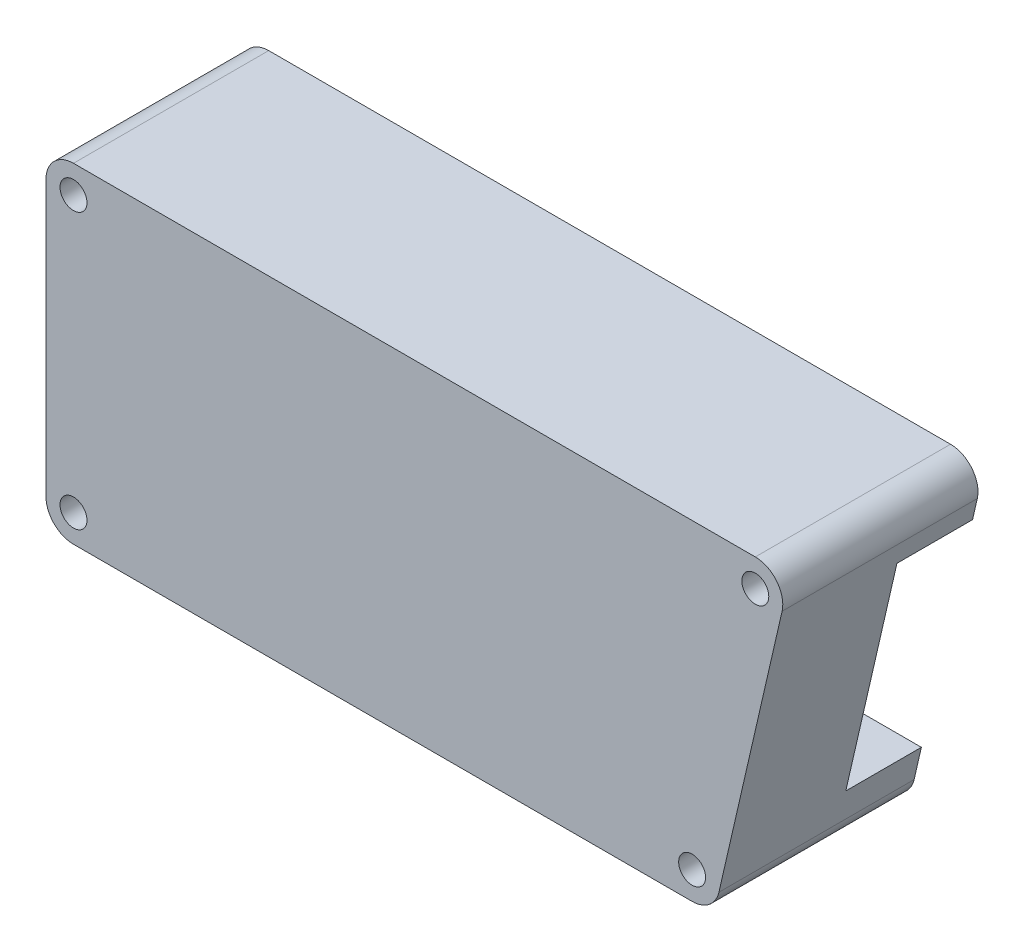
ISO-10303-21;
HEADER;
FILE_DESCRIPTION(('STEP AP214'),'2;1');
FILE_NAME('part.step','',(''),(''),'','','');
FILE_SCHEMA(('AUTOMOTIVE_DESIGN { 1 0 10303 214 1 1 1 1 }'));
ENDSEC;
DATA;
#1=APPLICATION_CONTEXT('core data for automotive mechanical design processes');
#2=APPLICATION_PROTOCOL_DEFINITION('international standard','automotive_design',2000,#1);
#3=PRODUCT_CONTEXT('',#1,'mechanical');
#4=PRODUCT('Part','Part','',(#3));
#5=PRODUCT_RELATED_PRODUCT_CATEGORY('part','',(#4));
#6=PRODUCT_DEFINITION_FORMATION('','',#4);
#7=PRODUCT_DEFINITION_CONTEXT('part definition',#1,'design');
#8=PRODUCT_DEFINITION('design','',#6,#7);
#9=PRODUCT_DEFINITION_SHAPE('','',#8);
#10=(LENGTH_UNIT() NAMED_UNIT(*) SI_UNIT(.MILLI.,.METRE.));
#11=(NAMED_UNIT(*) PLANE_ANGLE_UNIT() SI_UNIT($,.RADIAN.));
#12=(NAMED_UNIT(*) SI_UNIT($,.STERADIAN.) SOLID_ANGLE_UNIT());
#13=UNCERTAINTY_MEASURE_WITH_UNIT(LENGTH_MEASURE(1.E-05),#10,'distance_accuracy_value','');
#14=(GEOMETRIC_REPRESENTATION_CONTEXT(3) GLOBAL_UNCERTAINTY_ASSIGNED_CONTEXT((#13)) GLOBAL_UNIT_ASSIGNED_CONTEXT((#10,
#11,#12)) REPRESENTATION_CONTEXT('',''));
#15=CARTESIAN_POINT('',(0.,0.,0.));
#16=DIRECTION('',(0.,0.,1.));
#17=DIRECTION('',(1.,0.,0.));
#18=AXIS2_PLACEMENT_3D('',#15,#16,#17);
#19=CARTESIAN_POINT('',(47.0138015883952,632.037366400277,0.));
#20=DIRECTION('',(0.,0.,1.));
#21=DIRECTION('',(1.,0.,0.));
#22=AXIS2_PLACEMENT_3D('',#19,#20,#21);
#23=PLANE('',#22);
#24=CARTESIAN_POINT('',(161.313801588395,632.037366400277,0.));
#25=DIRECTION('',(0.,0.,1.));
#26=DIRECTION('',(1.,0.,0.));
#27=AXIS2_PLACEMENT_3D('',#24,#25,#26);
#28=CIRCLE('',#27,2.48919999999999);
#29=CARTESIAN_POINT('',(163.803001588395,632.037366400277,0.));
#30=VERTEX_POINT('',#29);
#31=EDGE_CURVE('E440',#30,#30,#28,.T.);
#32=ORIENTED_EDGE('',*,*,#31,.T.);
#33=EDGE_LOOP('',(#32));
#34=FACE_BOUND('',#33,.T.);
#35=CARTESIAN_POINT('',(47.0138015883952,632.037366400277,0.));
#36=DIRECTION('',(0.,0.,1.));
#37=DIRECTION('',(1.,0.,0.));
#38=AXIS2_PLACEMENT_3D('',#35,#36,#37);
#39=CIRCLE('',#38,2.48919999999998);
#40=CARTESIAN_POINT('',(49.5030015883951,632.037366400277,0.));
#41=VERTEX_POINT('',#40);
#42=EDGE_CURVE('E251',#41,#41,#39,.T.);
#43=ORIENTED_EDGE('',*,*,#42,.T.);
#44=EDGE_LOOP('',(#43));
#45=FACE_BOUND('',#44,.T.);
#46=DIRECTION('',(1.,0.,0.));
#47=VECTOR('',#46,1.);
#48=CARTESIAN_POINT('',(-8.54869841160494,636.731886589951,0.));
#49=LINE('',#48,#47);
#50=CARTESIAN_POINT('',(41.9338015883952,636.731886589951,0.));
#51=VERTEX_POINT('',#50);
#52=CARTESIAN_POINT('',(167.604993239421,636.731886589951,0.));
#53=VERTEX_POINT('',#52);
#54=EDGE_CURVE('E238',#51,#53,#49,.T.);
#55=ORIENTED_EDGE('',*,*,#54,.T.);
#56=DIRECTION('',(0.223960029134119,0.974598330262393,0.));
#57=VECTOR('',#56,1.);
#58=CARTESIAN_POINT('',(166.264761106128,630.899649452275,0.));
#59=LINE('',#58,#57);
#60=CARTESIAN_POINT('',(166.264761106128,630.899649452275,0.));
#61=VERTEX_POINT('',#60);
#62=EDGE_CURVE('E174',#61,#53,#59,.T.);
#63=ORIENTED_EDGE('',*,*,#62,.F.);
#64=CARTESIAN_POINT('',(161.313801588395,632.037366400277,0.));
#65=DIRECTION('',(0.,0.,1.));
#66=DIRECTION('',(1.,0.,0.));
#67=AXIS2_PLACEMENT_3D('',#64,#65,#66);
#68=CIRCLE('',#67,5.07999999999997);
#69=CARTESIAN_POINT('',(161.313801588395,626.957366400277,0.));
#70=VERTEX_POINT('',#69);
#71=EDGE_CURVE('E170',#70,#61,#68,.T.);
#72=ORIENTED_EDGE('',*,*,#71,.F.);
#73=DIRECTION('',(1.,0.,0.));
#74=VECTOR('',#73,1.);
#75=CARTESIAN_POINT('',(47.0138015883952,626.957366400277,0.));
#76=LINE('',#75,#74);
#77=CARTESIAN_POINT('',(47.0138015883952,626.957366400277,0.));
#78=VERTEX_POINT('',#77);
#79=EDGE_CURVE('E166',#78,#70,#76,.T.);
#80=ORIENTED_EDGE('',*,*,#79,.F.);
#81=CARTESIAN_POINT('',(47.0138015883952,632.037366400277,0.));
#82=DIRECTION('',(0.,0.,1.));
#83=DIRECTION('',(1.,0.,0.));
#84=AXIS2_PLACEMENT_3D('',#81,#82,#83);
#85=CIRCLE('',#84,5.07999999999999);
#86=CARTESIAN_POINT('',(41.9338015883952,632.037366400277,0.));
#87=VERTEX_POINT('',#86);
#88=EDGE_CURVE('E162',#87,#78,#85,.T.);
#89=ORIENTED_EDGE('',*,*,#88,.F.);
#90=DIRECTION('',(0.,-1.,0.));
#91=VECTOR('',#90,1.);
#92=CARTESIAN_POINT('',(41.9338015883952,632.037366400277,0.));
#93=LINE('',#92,#91);
#94=EDGE_CURVE('E104',#51,#87,#93,.T.);
#95=ORIENTED_EDGE('',*,*,#94,.F.);
#96=EDGE_LOOP('',(#55,#63,#72,#80,#89,#95));
#97=FACE_BOUND('',#96,.T.);
#98=ADVANCED_FACE('F47',(#34,#45,#97),#23,.F.);
#99=CARTESIAN_POINT('',(172.987502565238,682.837366400277,0.));
#100=DIRECTION('',(0.,0.,1.));
#101=DIRECTION('',(1.,0.,0.));
#102=AXIS2_PLACEMENT_3D('',#99,#100,#101);
#103=CIRCLE('',#102,2.48919999999999);
#104=CARTESIAN_POINT('',(175.476702565238,682.837366400277,0.));
#105=VERTEX_POINT('',#104);
#106=EDGE_CURVE('E453',#105,#105,#103,.T.);
#107=ORIENTED_EDGE('',*,*,#106,.T.);
#108=EDGE_LOOP('',(#107));
#109=FACE_BOUND('',#108,.T.);
#110=CARTESIAN_POINT('',(47.0138015883952,682.837366400277,0.));
#111=DIRECTION('',(0.,0.,1.));
#112=DIRECTION('',(1.,0.,0.));
#113=AXIS2_PLACEMENT_3D('',#110,#111,#112);
#114=CIRCLE('',#113,2.48919999999998);
#115=CARTESIAN_POINT('',(49.5030015883951,682.837366400277,0.));
#116=VERTEX_POINT('',#115);
#117=EDGE_CURVE('E446',#116,#116,#114,.T.);
#118=ORIENTED_EDGE('',*,*,#117,.T.);
#119=EDGE_LOOP('',(#118));
#120=FACE_BOUND('',#119,.T.);
#121=DIRECTION('',(-1.,0.,0.));
#122=VECTOR('',#121,1.);
#123=CARTESIAN_POINT('',(-8.54869841160495,677.879886589951,0.));
#124=LINE('',#123,#122);
#125=CARTESIAN_POINT('',(177.060691030663,677.879886589951,0.));
#126=VERTEX_POINT('',#125);
#127=CARTESIAN_POINT('',(41.9338015883952,677.879886589951,0.));
#128=VERTEX_POINT('',#127);
#129=EDGE_CURVE('E226',#126,#128,#124,.T.);
#130=ORIENTED_EDGE('',*,*,#129,.T.);
#131=CARTESIAN_POINT('',(41.9338015883952,682.837366400277,0.));
#132=VERTEX_POINT('',#131);
#133=EDGE_CURVE('E186',#132,#128,#93,.T.);
#134=ORIENTED_EDGE('',*,*,#133,.F.);
#135=CARTESIAN_POINT('',(47.0138015883952,682.837366400277,0.));
#136=DIRECTION('',(0.,0.,1.));
#137=DIRECTION('',(1.,0.,0.));
#138=AXIS2_PLACEMENT_3D('',#135,#136,#137);
#139=CIRCLE('',#138,5.07999999999998);
#140=CARTESIAN_POINT('',(47.0138015883952,687.917366400277,0.));
#141=VERTEX_POINT('',#140);
#142=EDGE_CURVE('E183',#141,#132,#139,.T.);
#143=ORIENTED_EDGE('',*,*,#142,.F.);
#144=DIRECTION('',(-1.,0.,0.));
#145=VECTOR('',#144,1.);
#146=CARTESIAN_POINT('',(47.0138015883952,687.917366400277,0.));
#147=LINE('',#146,#145);
#148=CARTESIAN_POINT('',(172.987502565238,687.917366400277,0.));
#149=VERTEX_POINT('',#148);
#150=EDGE_CURVE('E146',#149,#141,#147,.T.);
#151=ORIENTED_EDGE('',*,*,#150,.F.);
#152=CARTESIAN_POINT('',(172.987502565238,682.837366400277,0.));
#153=DIRECTION('',(0.,0.,1.));
#154=DIRECTION('',(1.,0.,0.));
#155=AXIS2_PLACEMENT_3D('',#152,#153,#154);
#156=CIRCLE('',#155,5.07999999999985);
#157=CARTESIAN_POINT('',(177.938462082971,681.699649452275,0.));
#158=VERTEX_POINT('',#157);
#159=EDGE_CURVE('E178',#158,#149,#156,.T.);
#160=ORIENTED_EDGE('',*,*,#159,.F.);
#161=EDGE_CURVE('E173',#126,#158,#59,.T.);
#162=ORIENTED_EDGE('',*,*,#161,.F.);
#163=EDGE_LOOP('',(#130,#134,#143,#151,#160,#162));
#164=FACE_BOUND('',#163,.T.);
#165=ADVANCED_FACE('F235',(#109,#120,#164),#23,.F.);
#166=CARTESIAN_POINT('',(166.264761106128,630.899649452275,36.068));
#167=DIRECTION('',(-0.974598330262393,0.223960029134119,0.));
#168=DIRECTION('',(-0.223960029134119,-0.974598330262393,0.));
#169=AXIS2_PLACEMENT_3D('',#166,#167,#168);
#170=PLANE('',#169);
#171=DIRECTION('',(0.,0.,-1.));
#172=VECTOR('',#171,1.);
#173=CARTESIAN_POINT('',(167.604993239421,636.731886589951,36.068));
#174=LINE('',#173,#172);
#175=CARTESIAN_POINT('',(167.604993239421,636.731886589951,13.97));
#176=VERTEX_POINT('',#175);
#177=EDGE_CURVE('E457',#176,#53,#174,.T.);
#178=ORIENTED_EDGE('',*,*,#177,.F.);
#179=DIRECTION('',(0.223960029134119,0.974598330262393,0.));
#180=VECTOR('',#179,1.);
#181=CARTESIAN_POINT('',(166.264761106128,630.899649452275,13.97));
#182=LINE('',#181,#180);
#183=CARTESIAN_POINT('',(177.060691030663,677.879886589951,13.97));
#184=VERTEX_POINT('',#183);
#185=EDGE_CURVE('E467',#176,#184,#182,.T.);
#186=ORIENTED_EDGE('',*,*,#185,.T.);
#187=DIRECTION('',(0.,0.,1.));
#188=VECTOR('',#187,1.);
#189=CARTESIAN_POINT('',(177.060691030663,677.879886589951,36.068));
#190=LINE('',#189,#188);
#191=EDGE_CURVE('E464',#126,#184,#190,.T.);
#192=ORIENTED_EDGE('',*,*,#191,.F.);
#193=ORIENTED_EDGE('',*,*,#161,.T.);
#194=DIRECTION('',(0.,0.,-1.));
#195=VECTOR('',#194,1.);
#196=CARTESIAN_POINT('',(177.938462082971,681.699649452275,36.068));
#197=LINE('',#196,#195);
#198=CARTESIAN_POINT('',(177.938462082971,681.699649452275,36.068));
#199=VERTEX_POINT('',#198);
#200=EDGE_CURVE('E197',#199,#158,#197,.T.);
#201=ORIENTED_EDGE('',*,*,#200,.F.);
#202=DIRECTION('',(0.223960029134119,0.974598330262393,0.));
#203=VECTOR('',#202,1.);
#204=CARTESIAN_POINT('',(166.264761106128,630.899649452275,36.068));
#205=LINE('',#204,#203);
#206=CARTESIAN_POINT('',(166.264761106128,630.899649452275,36.068));
#207=VERTEX_POINT('',#206);
#208=EDGE_CURVE('E256',#207,#199,#205,.T.);
#209=ORIENTED_EDGE('',*,*,#208,.F.);
#210=DIRECTION('',(0.,0.,-1.));
#211=VECTOR('',#210,1.);
#212=CARTESIAN_POINT('',(166.264761106128,630.899649452275,36.068));
#213=LINE('',#212,#211);
#214=EDGE_CURVE('E201',#207,#61,#213,.T.);
#215=ORIENTED_EDGE('',*,*,#214,.T.);
#216=ORIENTED_EDGE('',*,*,#62,.T.);
#217=EDGE_LOOP('',(#178,#186,#192,#193,#201,#209,#215,#216));
#218=FACE_BOUND('',#217,.T.);
#219=ADVANCED_FACE('F265',(#218),#170,.F.);
#220=CARTESIAN_POINT('',(41.9338015883952,632.037366400277,36.068));
#221=DIRECTION('',(1.,0.,0.));
#222=DIRECTION('',(0.,1.,0.));
#223=AXIS2_PLACEMENT_3D('',#220,#221,#222);
#224=PLANE('',#223);
#225=DIRECTION('',(0.,0.,1.));
#226=VECTOR('',#225,1.);
#227=CARTESIAN_POINT('',(41.9338015883952,636.731886589951,36.068));
#228=LINE('',#227,#226);
#229=CARTESIAN_POINT('',(41.9338015883952,636.731886589951,13.97));
#230=VERTEX_POINT('',#229);
#231=EDGE_CURVE('E11',#51,#230,#228,.T.);
#232=ORIENTED_EDGE('',*,*,#231,.F.);
#233=ORIENTED_EDGE('',*,*,#94,.T.);
#234=DIRECTION('',(0.,0.,-1.));
#235=VECTOR('',#234,1.);
#236=CARTESIAN_POINT('',(41.9338015883952,632.037366400277,36.068));
#237=LINE('',#236,#235);
#238=CARTESIAN_POINT('',(41.9338015883952,632.037366400277,36.068));
#239=VERTEX_POINT('',#238);
#240=EDGE_CURVE('E158',#239,#87,#237,.T.);
#241=ORIENTED_EDGE('',*,*,#240,.F.);
#242=DIRECTION('',(0.,-1.,0.));
#243=VECTOR('',#242,1.);
#244=CARTESIAN_POINT('',(41.9338015883952,632.037366400277,36.068));
#245=LINE('',#244,#243);
#246=CARTESIAN_POINT('',(41.9338015883952,682.837366400277,36.068));
#247=VERTEX_POINT('',#246);
#248=EDGE_CURVE('E71',#247,#239,#245,.T.);
#249=ORIENTED_EDGE('',*,*,#248,.F.);
#250=DIRECTION('',(0.,0.,-1.));
#251=VECTOR('',#250,1.);
#252=CARTESIAN_POINT('',(41.9338015883952,682.837366400277,36.068));
#253=LINE('',#252,#251);
#254=EDGE_CURVE('E151',#247,#132,#253,.T.);
#255=ORIENTED_EDGE('',*,*,#254,.T.);
#256=ORIENTED_EDGE('',*,*,#133,.T.);
#257=DIRECTION('',(0.,0.,-1.));
#258=VECTOR('',#257,1.);
#259=CARTESIAN_POINT('',(41.9338015883952,677.879886589951,36.068));
#260=LINE('',#259,#258);
#261=CARTESIAN_POINT('',(41.9338015883952,677.879886589951,13.97));
#262=VERTEX_POINT('',#261);
#263=EDGE_CURVE('E56',#262,#128,#260,.T.);
#264=ORIENTED_EDGE('',*,*,#263,.F.);
#265=DIRECTION('',(0.,-1.,0.));
#266=VECTOR('',#265,1.);
#267=CARTESIAN_POINT('',(41.9338015883952,632.037366400277,13.97));
#268=LINE('',#267,#266);
#269=EDGE_CURVE('E212',#262,#230,#268,.T.);
#270=ORIENTED_EDGE('',*,*,#269,.T.);
#271=EDGE_LOOP('',(#232,#233,#241,#249,#255,#256,#264,#270));
#272=FACE_BOUND('',#271,.T.);
#273=ADVANCED_FACE('F240',(#272),#224,.F.);
#274=CARTESIAN_POINT('',(47.0138015883952,632.037366400277,36.068));
#275=DIRECTION('',(0.,0.,1.));
#276=DIRECTION('',(1.,0.,0.));
#277=AXIS2_PLACEMENT_3D('',#274,#275,#276);
#278=PLANE('',#277);
#279=CARTESIAN_POINT('',(47.0138015883952,682.837366400277,36.068));
#280=DIRECTION('',(0.,0.,1.));
#281=DIRECTION('',(1.,0.,0.));
#282=AXIS2_PLACEMENT_3D('',#279,#280,#281);
#283=CIRCLE('',#282,2.48919999999998);
#284=CARTESIAN_POINT('',(49.5030015883951,682.837366400277,36.068));
#285=VERTEX_POINT('',#284);
#286=EDGE_CURVE('E433',#285,#285,#283,.T.);
#287=ORIENTED_EDGE('',*,*,#286,.F.);
#288=EDGE_LOOP('',(#287));
#289=FACE_BOUND('',#288,.T.);
#290=CARTESIAN_POINT('',(47.0138015883952,632.037366400277,36.068));
#291=DIRECTION('',(0.,0.,1.));
#292=DIRECTION('',(1.,0.,0.));
#293=AXIS2_PLACEMENT_3D('',#290,#291,#292);
#294=CIRCLE('',#293,2.48919999999998);
#295=CARTESIAN_POINT('',(49.5030015883951,632.037366400277,36.068));
#296=VERTEX_POINT('',#295);
#297=EDGE_CURVE('E167',#296,#296,#294,.T.);
#298=ORIENTED_EDGE('',*,*,#297,.F.);
#299=EDGE_LOOP('',(#298));
#300=FACE_BOUND('',#299,.T.);
#301=CARTESIAN_POINT('',(47.0138015883952,632.037366400277,36.068));
#302=DIRECTION('',(0.,0.,1.));
#303=DIRECTION('',(1.,0.,0.));
#304=AXIS2_PLACEMENT_3D('',#301,#302,#303);
#305=CIRCLE('',#304,5.07999999999999);
#306=CARTESIAN_POINT('',(47.0138015883952,626.957366400277,36.068));
#307=VERTEX_POINT('',#306);
#308=EDGE_CURVE('E190',#239,#307,#305,.T.);
#309=ORIENTED_EDGE('',*,*,#308,.T.);
#310=DIRECTION('',(1.,0.,0.));
#311=VECTOR('',#310,1.);
#312=CARTESIAN_POINT('',(47.0138015883952,626.957366400277,36.068));
#313=LINE('',#312,#311);
#314=CARTESIAN_POINT('',(161.313801588395,626.957366400277,36.068));
#315=VERTEX_POINT('',#314);
#316=EDGE_CURVE('E113',#307,#315,#313,.T.);
#317=ORIENTED_EDGE('',*,*,#316,.T.);
#318=CARTESIAN_POINT('',(161.313801588395,632.037366400277,36.068));
#319=DIRECTION('',(0.,0.,1.));
#320=DIRECTION('',(1.,0.,0.));
#321=AXIS2_PLACEMENT_3D('',#318,#319,#320);
#322=CIRCLE('',#321,5.07999999999997);
#323=EDGE_CURVE('E248',#315,#207,#322,.T.);
#324=ORIENTED_EDGE('',*,*,#323,.T.);
#325=ORIENTED_EDGE('',*,*,#208,.T.);
#326=CARTESIAN_POINT('',(172.987502565238,682.837366400277,36.068));
#327=DIRECTION('',(0.,0.,1.));
#328=DIRECTION('',(1.,0.,0.));
#329=AXIS2_PLACEMENT_3D('',#326,#327,#328);
#330=CIRCLE('',#329,5.07999999999985);
#331=CARTESIAN_POINT('',(172.987502565238,687.917366400277,36.068));
#332=VERTEX_POINT('',#331);
#333=EDGE_CURVE('E136',#199,#332,#330,.T.);
#334=ORIENTED_EDGE('',*,*,#333,.T.);
#335=DIRECTION('',(-1.,0.,0.));
#336=VECTOR('',#335,1.);
#337=CARTESIAN_POINT('',(47.0138015883952,687.917366400277,36.068));
#338=LINE('',#337,#336);
#339=CARTESIAN_POINT('',(47.0138015883952,687.917366400277,36.068));
#340=VERTEX_POINT('',#339);
#341=EDGE_CURVE('E128',#332,#340,#338,.T.);
#342=ORIENTED_EDGE('',*,*,#341,.T.);
#343=CARTESIAN_POINT('',(47.0138015883952,682.837366400277,36.068));
#344=DIRECTION('',(0.,0.,1.));
#345=DIRECTION('',(1.,0.,0.));
#346=AXIS2_PLACEMENT_3D('',#343,#344,#345);
#347=CIRCLE('',#346,5.07999999999998);
#348=EDGE_CURVE('E133',#340,#247,#347,.T.);
#349=ORIENTED_EDGE('',*,*,#348,.T.);
#350=ORIENTED_EDGE('',*,*,#248,.T.);
#351=EDGE_LOOP('',(#309,#317,#324,#325,#334,#342,#349,#350));
#352=FACE_BOUND('',#351,.T.);
#353=CARTESIAN_POINT('',(161.313801588395,632.037366400277,36.068));
#354=DIRECTION('',(0.,0.,1.));
#355=DIRECTION('',(1.,0.,0.));
#356=AXIS2_PLACEMENT_3D('',#353,#354,#355);
#357=CIRCLE('',#356,2.48919999999999);
#358=CARTESIAN_POINT('',(163.803001588395,632.037366400277,36.068));
#359=VERTEX_POINT('',#358);
#360=EDGE_CURVE('E438',#359,#359,#357,.T.);
#361=ORIENTED_EDGE('',*,*,#360,.F.);
#362=EDGE_LOOP('',(#361));
#363=FACE_BOUND('',#362,.T.);
#364=CARTESIAN_POINT('',(172.987502565238,682.837366400277,36.068));
#365=DIRECTION('',(0.,0.,1.));
#366=DIRECTION('',(1.,0.,0.));
#367=AXIS2_PLACEMENT_3D('',#364,#365,#366);
#368=CIRCLE('',#367,2.48919999999999);
#369=CARTESIAN_POINT('',(175.476702565238,682.837366400277,36.068));
#370=VERTEX_POINT('',#369);
#371=EDGE_CURVE('E450',#370,#370,#368,.T.);
#372=ORIENTED_EDGE('',*,*,#371,.F.);
#373=EDGE_LOOP('',(#372));
#374=FACE_BOUND('',#373,.T.);
#375=ADVANCED_FACE('F130',(#289,#300,#352,#363,#374),#278,.T.);
#376=CARTESIAN_POINT('',(47.0138015883952,632.037366400277,36.068));
#377=DIRECTION('',(0.,0.,-1.));
#378=DIRECTION('',(-1.,0.,0.));
#379=AXIS2_PLACEMENT_3D('',#376,#377,#378);
#380=CYLINDRICAL_SURFACE('',#379,5.07999999999999);
#381=ORIENTED_EDGE('',*,*,#88,.T.);
#382=DIRECTION('',(0.,0.,-1.));
#383=VECTOR('',#382,1.);
#384=CARTESIAN_POINT('',(47.0138015883952,626.957366400277,36.068));
#385=LINE('',#384,#383);
#386=EDGE_CURVE('E209',#307,#78,#385,.T.);
#387=ORIENTED_EDGE('',*,*,#386,.F.);
#388=ORIENTED_EDGE('',*,*,#308,.F.);
#389=ORIENTED_EDGE('',*,*,#240,.T.);
#390=EDGE_LOOP('',(#381,#387,#388,#389));
#391=FACE_BOUND('',#390,.T.);
#392=ADVANCED_FACE('F49',(#391),#380,.T.);
#393=CARTESIAN_POINT('',(47.0138015883952,626.957366400277,36.068));
#394=DIRECTION('',(0.,1.,0.));
#395=DIRECTION('',(0.,0.,1.));
#396=AXIS2_PLACEMENT_3D('',#393,#394,#395);
#397=PLANE('',#396);
#398=ORIENTED_EDGE('',*,*,#79,.T.);
#399=DIRECTION('',(0.,0.,-1.));
#400=VECTOR('',#399,1.);
#401=CARTESIAN_POINT('',(161.313801588395,626.957366400277,36.068));
#402=LINE('',#401,#400);
#403=EDGE_CURVE('E205',#315,#70,#402,.T.);
#404=ORIENTED_EDGE('',*,*,#403,.F.);
#405=ORIENTED_EDGE('',*,*,#316,.F.);
#406=ORIENTED_EDGE('',*,*,#386,.T.);
#407=EDGE_LOOP('',(#398,#404,#405,#406));
#408=FACE_BOUND('',#407,.T.);
#409=ADVANCED_FACE('F276',(#408),#397,.F.);
#410=CARTESIAN_POINT('',(161.313801588395,632.037366400277,36.068));
#411=DIRECTION('',(0.,0.,-1.));
#412=DIRECTION('',(-1.,0.,0.));
#413=AXIS2_PLACEMENT_3D('',#410,#411,#412);
#414=CYLINDRICAL_SURFACE('',#413,5.07999999999997);
#415=ORIENTED_EDGE('',*,*,#71,.T.);
#416=ORIENTED_EDGE('',*,*,#214,.F.);
#417=ORIENTED_EDGE('',*,*,#323,.F.);
#418=ORIENTED_EDGE('',*,*,#403,.T.);
#419=EDGE_LOOP('',(#415,#416,#417,#418));
#420=FACE_BOUND('',#419,.T.);
#421=ADVANCED_FACE('F269',(#420),#414,.T.);
#422=CARTESIAN_POINT('',(172.987502565238,682.837366400277,36.068));
#423=DIRECTION('',(0.,0.,-1.));
#424=DIRECTION('',(-1.,0.,0.));
#425=AXIS2_PLACEMENT_3D('',#422,#423,#424);
#426=CYLINDRICAL_SURFACE('',#425,5.07999999999985);
#427=ORIENTED_EDGE('',*,*,#159,.T.);
#428=DIRECTION('',(0.,0.,-1.));
#429=VECTOR('',#428,1.);
#430=CARTESIAN_POINT('',(172.987502565238,687.917366400277,36.068));
#431=LINE('',#430,#429);
#432=EDGE_CURVE('E150',#332,#149,#431,.T.);
#433=ORIENTED_EDGE('',*,*,#432,.F.);
#434=ORIENTED_EDGE('',*,*,#333,.F.);
#435=ORIENTED_EDGE('',*,*,#200,.T.);
#436=EDGE_LOOP('',(#427,#433,#434,#435));
#437=FACE_BOUND('',#436,.T.);
#438=ADVANCED_FACE('F267',(#437),#426,.T.);
#439=CARTESIAN_POINT('',(47.0138015883952,687.917366400277,36.068));
#440=DIRECTION('',(0.,-1.,0.));
#441=DIRECTION('',(1.,0.,0.));
#442=AXIS2_PLACEMENT_3D('',#439,#440,#441);
#443=PLANE('',#442);
#444=ORIENTED_EDGE('',*,*,#150,.T.);
#445=DIRECTION('',(0.,0.,-1.));
#446=VECTOR('',#445,1.);
#447=CARTESIAN_POINT('',(47.0138015883952,687.917366400277,36.068));
#448=LINE('',#447,#446);
#449=EDGE_CURVE('E143',#340,#141,#448,.T.);
#450=ORIENTED_EDGE('',*,*,#449,.F.);
#451=ORIENTED_EDGE('',*,*,#341,.F.);
#452=ORIENTED_EDGE('',*,*,#432,.T.);
#453=EDGE_LOOP('',(#444,#450,#451,#452));
#454=FACE_BOUND('',#453,.T.);
#455=ADVANCED_FACE('F144',(#454),#443,.F.);
#456=CARTESIAN_POINT('',(47.0138015883952,682.837366400277,36.068));
#457=DIRECTION('',(0.,0.,-1.));
#458=DIRECTION('',(-1.,0.,0.));
#459=AXIS2_PLACEMENT_3D('',#456,#457,#458);
#460=CYLINDRICAL_SURFACE('',#459,5.07999999999998);
#461=ORIENTED_EDGE('',*,*,#142,.T.);
#462=ORIENTED_EDGE('',*,*,#254,.F.);
#463=ORIENTED_EDGE('',*,*,#348,.F.);
#464=ORIENTED_EDGE('',*,*,#449,.T.);
#465=EDGE_LOOP('',(#461,#462,#463,#464));
#466=FACE_BOUND('',#465,.T.);
#467=ADVANCED_FACE('F153',(#466),#460,.T.);
#468=CARTESIAN_POINT('',(47.0138015883952,632.037366400277,36.068));
#469=DIRECTION('',(0.,0.,-1.));
#470=DIRECTION('',(-1.,0.,0.));
#471=AXIS2_PLACEMENT_3D('',#468,#469,#470);
#472=CYLINDRICAL_SURFACE('',#471,2.48919999999998);
#473=ORIENTED_EDGE('',*,*,#297,.T.);
#474=EDGE_LOOP('',(#473));
#475=FACE_BOUND('',#474,.T.);
#476=ORIENTED_EDGE('',*,*,#42,.F.);
#477=EDGE_LOOP('',(#476));
#478=FACE_BOUND('',#477,.T.);
#479=ADVANCED_FACE('F296',(#475,#478),#472,.F.);
#480=CARTESIAN_POINT('',(161.313801588395,632.037366400277,36.068));
#481=DIRECTION('',(0.,0.,-1.));
#482=DIRECTION('',(-1.,0.,0.));
#483=AXIS2_PLACEMENT_3D('',#480,#481,#482);
#484=CYLINDRICAL_SURFACE('',#483,2.48919999999999);
#485=ORIENTED_EDGE('',*,*,#360,.T.);
#486=EDGE_LOOP('',(#485));
#487=FACE_BOUND('',#486,.T.);
#488=ORIENTED_EDGE('',*,*,#31,.F.);
#489=EDGE_LOOP('',(#488));
#490=FACE_BOUND('',#489,.T.);
#491=ADVANCED_FACE('F300',(#487,#490),#484,.F.);
#492=CARTESIAN_POINT('',(47.0138015883952,682.837366400277,36.068));
#493=DIRECTION('',(0.,0.,-1.));
#494=DIRECTION('',(-1.,0.,0.));
#495=AXIS2_PLACEMENT_3D('',#492,#493,#494);
#496=CYLINDRICAL_SURFACE('',#495,2.48919999999998);
#497=ORIENTED_EDGE('',*,*,#286,.T.);
#498=EDGE_LOOP('',(#497));
#499=FACE_BOUND('',#498,.T.);
#500=ORIENTED_EDGE('',*,*,#117,.F.);
#501=EDGE_LOOP('',(#500));
#502=FACE_BOUND('',#501,.T.);
#503=ADVANCED_FACE('F305',(#499,#502),#496,.F.);
#504=CARTESIAN_POINT('',(172.987502565238,682.837366400277,36.068));
#505=DIRECTION('',(0.,0.,-1.));
#506=DIRECTION('',(-1.,0.,0.));
#507=AXIS2_PLACEMENT_3D('',#504,#505,#506);
#508=CYLINDRICAL_SURFACE('',#507,2.48919999999999);
#509=ORIENTED_EDGE('',*,*,#371,.T.);
#510=EDGE_LOOP('',(#509));
#511=FACE_BOUND('',#510,.T.);
#512=ORIENTED_EDGE('',*,*,#106,.F.);
#513=EDGE_LOOP('',(#512));
#514=FACE_BOUND('',#513,.T.);
#515=ADVANCED_FACE('F313',(#511,#514),#508,.F.);
#516=CARTESIAN_POINT('',(-8.54869841160494,636.731886589951,13.97));
#517=DIRECTION('',(0.,1.,0.));
#518=DIRECTION('',(0.,0.,1.));
#519=AXIS2_PLACEMENT_3D('',#516,#517,#518);
#520=PLANE('',#519);
#521=ORIENTED_EDGE('',*,*,#177,.T.);
#522=ORIENTED_EDGE('',*,*,#54,.F.);
#523=ORIENTED_EDGE('',*,*,#231,.T.);
#524=DIRECTION('',(1.,0.,0.));
#525=VECTOR('',#524,1.);
#526=CARTESIAN_POINT('',(-8.54869841160494,636.731886589951,13.97));
#527=LINE('',#526,#525);
#528=EDGE_CURVE('E63',#230,#176,#527,.T.);
#529=ORIENTED_EDGE('',*,*,#528,.T.);
#530=EDGE_LOOP('',(#521,#522,#523,#529));
#531=FACE_BOUND('',#530,.T.);
#532=ADVANCED_FACE('F316',(#531),#520,.T.);
#533=CARTESIAN_POINT('',(-8.54869841160495,677.879886589951,13.97));
#534=DIRECTION('',(0.,-1.,0.));
#535=DIRECTION('',(0.,0.,-1.));
#536=AXIS2_PLACEMENT_3D('',#533,#534,#535);
#537=PLANE('',#536);
#538=ORIENTED_EDGE('',*,*,#191,.T.);
#539=DIRECTION('',(-1.,0.,0.));
#540=VECTOR('',#539,1.);
#541=CARTESIAN_POINT('',(-8.54869841160495,677.879886589951,13.97));
#542=LINE('',#541,#540);
#543=EDGE_CURVE('E229',#184,#262,#542,.T.);
#544=ORIENTED_EDGE('',*,*,#543,.T.);
#545=ORIENTED_EDGE('',*,*,#263,.T.);
#546=ORIENTED_EDGE('',*,*,#129,.F.);
#547=EDGE_LOOP('',(#538,#544,#545,#546));
#548=FACE_BOUND('',#547,.T.);
#549=ADVANCED_FACE('F224',(#548),#537,.T.);
#550=CARTESIAN_POINT('',(0.,0.,13.97));
#551=DIRECTION('',(0.,0.,1.));
#552=DIRECTION('',(1.,0.,0.));
#553=AXIS2_PLACEMENT_3D('',#550,#551,#552);
#554=PLANE('',#553);
#555=ORIENTED_EDGE('',*,*,#528,.F.);
#556=ORIENTED_EDGE('',*,*,#269,.F.);
#557=ORIENTED_EDGE('',*,*,#543,.F.);
#558=ORIENTED_EDGE('',*,*,#185,.F.);
#559=EDGE_LOOP('',(#555,#556,#557,#558));
#560=FACE_BOUND('',#559,.T.);
#561=ADVANCED_FACE('F323',(#560),#554,.F.);
#562=CLOSED_SHELL('',(#98,#165,#219,#273,#375,#392,#409,#421,#438,#455,#467,#479,#491,#503,#515,
#532,#549,#561));
#563=MANIFOLD_SOLID_BREP('B2',#562);
#564=ADVANCED_BREP_SHAPE_REPRESENTATION('',(#18,#563),#14);
#565=SHAPE_DEFINITION_REPRESENTATION(#9,#564);
ENDSEC;
END-ISO-10303-21;
